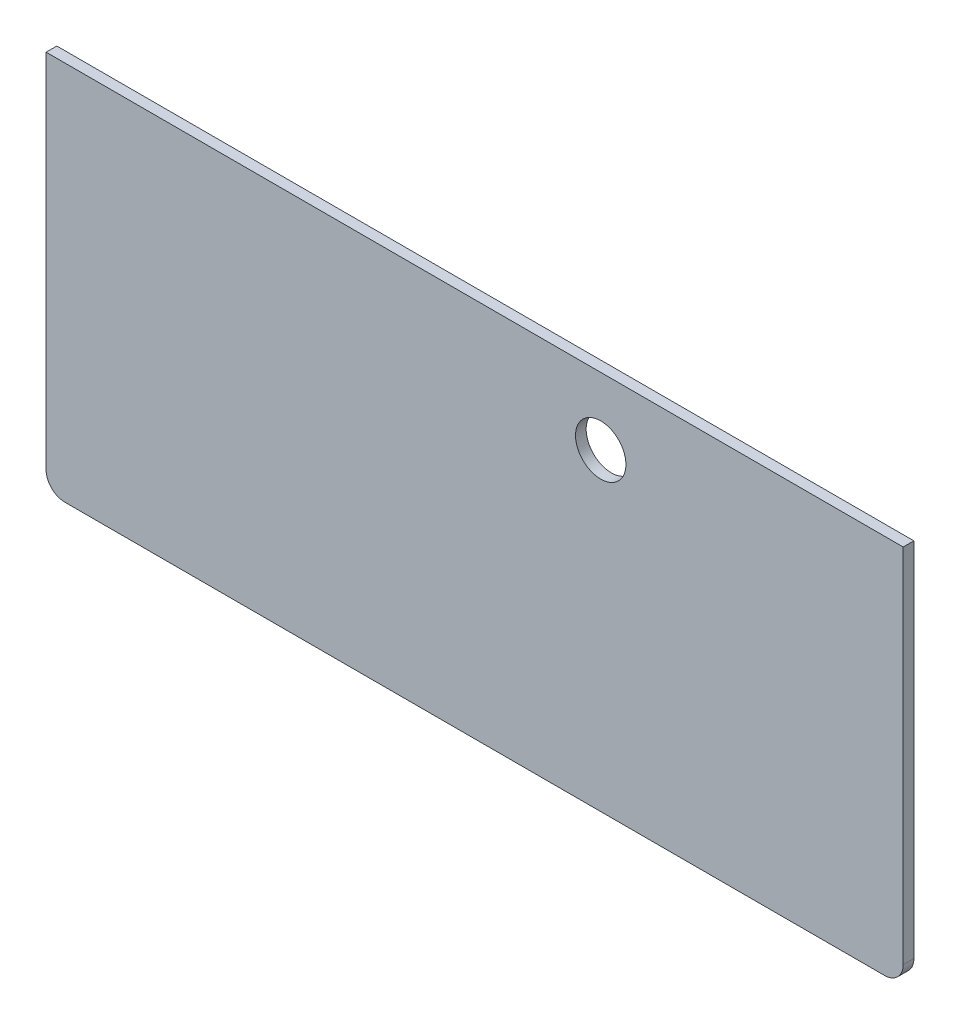
ISO-10303-21;
HEADER;
FILE_DESCRIPTION(('STEP AP214'),'2;1');
FILE_NAME('part.step','',(''),(''),'','','');
FILE_SCHEMA(('AUTOMOTIVE_DESIGN { 1 0 10303 214 1 1 1 1 }'));
ENDSEC;
DATA;
#1=APPLICATION_CONTEXT('core data for automotive mechanical design processes');
#2=APPLICATION_PROTOCOL_DEFINITION('international standard','automotive_design',2000,#1);
#3=PRODUCT_CONTEXT('',#1,'mechanical');
#4=PRODUCT('Part','Part','',(#3));
#5=PRODUCT_RELATED_PRODUCT_CATEGORY('part','',(#4));
#6=PRODUCT_DEFINITION_FORMATION('','',#4);
#7=PRODUCT_DEFINITION_CONTEXT('part definition',#1,'design');
#8=PRODUCT_DEFINITION('design','',#6,#7);
#9=PRODUCT_DEFINITION_SHAPE('','',#8);
#10=(LENGTH_UNIT() NAMED_UNIT(*) SI_UNIT(.MILLI.,.METRE.));
#11=(NAMED_UNIT(*) PLANE_ANGLE_UNIT() SI_UNIT($,.RADIAN.));
#12=(NAMED_UNIT(*) SI_UNIT($,.STERADIAN.) SOLID_ANGLE_UNIT());
#13=UNCERTAINTY_MEASURE_WITH_UNIT(LENGTH_MEASURE(1.E-05),#10,'distance_accuracy_value','');
#14=(GEOMETRIC_REPRESENTATION_CONTEXT(3) GLOBAL_UNCERTAINTY_ASSIGNED_CONTEXT((#13)) GLOBAL_UNIT_ASSIGNED_CONTEXT((#10,
#11,#12)) REPRESENTATION_CONTEXT('',''));
#15=CARTESIAN_POINT('',(0.,0.,0.));
#16=DIRECTION('',(0.,0.,1.));
#17=DIRECTION('',(1.,0.,0.));
#18=AXIS2_PLACEMENT_3D('',#15,#16,#17);
#19=CARTESIAN_POINT('',(0.,0.,3.175));
#20=DIRECTION('',(0.,0.,1.));
#21=DIRECTION('',(1.,0.,0.));
#22=AXIS2_PLACEMENT_3D('',#19,#20,#21);
#23=PLANE('',#22);
#24=DIRECTION('',(0.,-1.,0.));
#25=VECTOR('',#24,1.);
#26=CARTESIAN_POINT('',(-151.765375854214,27.1867881548974,3.175));
#27=LINE('',#26,#25);
#28=CARTESIAN_POINT('',(-151.765375854214,27.1867881548974,3.175));
#29=VERTEX_POINT('',#28);
#30=CARTESIAN_POINT('',(-151.765375854214,-80.4319618451025,3.175));
#31=VERTEX_POINT('',#30);
#32=EDGE_CURVE('E86',#29,#31,#27,.T.);
#33=ORIENTED_EDGE('',*,*,#32,.T.);
#34=CARTESIAN_POINT('',(-146.209125854214,-80.4319618451025,3.175));
#35=DIRECTION('',(0.,0.,1.));
#36=DIRECTION('',(1.,0.,0.));
#37=AXIS2_PLACEMENT_3D('',#34,#35,#36);
#38=CIRCLE('',#37,5.55625);
#39=CARTESIAN_POINT('',(-146.209125854214,-85.9882118451025,3.175));
#40=VERTEX_POINT('',#39);
#41=EDGE_CURVE('E41',#31,#40,#38,.T.);
#42=ORIENTED_EDGE('',*,*,#41,.T.);
#43=DIRECTION('',(1.,0.,0.));
#44=VECTOR('',#43,1.);
#45=CARTESIAN_POINT('',(-151.765375854214,-85.9882118451025,3.175));
#46=LINE('',#45,#44);
#47=CARTESIAN_POINT('',(97.6783741457858,-85.9882118451025,3.175));
#48=VERTEX_POINT('',#47);
#49=EDGE_CURVE('E93',#40,#48,#46,.T.);
#50=ORIENTED_EDGE('',*,*,#49,.T.);
#51=CARTESIAN_POINT('',(97.6783741457859,-80.4319618451025,3.175));
#52=DIRECTION('',(0.,0.,1.));
#53=DIRECTION('',(1.,0.,0.));
#54=AXIS2_PLACEMENT_3D('',#51,#52,#53);
#55=CIRCLE('',#54,5.55625);
#56=CARTESIAN_POINT('',(103.234624145786,-80.4319618451025,3.175));
#57=VERTEX_POINT('',#56);
#58=EDGE_CURVE('E48',#48,#57,#55,.T.);
#59=ORIENTED_EDGE('',*,*,#58,.T.);
#60=DIRECTION('',(0.,1.,0.));
#61=VECTOR('',#60,1.);
#62=CARTESIAN_POINT('',(103.234624145786,-85.9882118451025,3.175));
#63=LINE('',#62,#61);
#64=CARTESIAN_POINT('',(103.234624145786,27.1867881548975,3.175));
#65=VERTEX_POINT('',#64);
#66=EDGE_CURVE('E98',#57,#65,#63,.T.);
#67=ORIENTED_EDGE('',*,*,#66,.T.);
#68=DIRECTION('',(-1.,0.,0.));
#69=VECTOR('',#68,1.);
#70=CARTESIAN_POINT('',(103.234624145786,27.1867881548975,3.175));
#71=LINE('',#70,#69);
#72=EDGE_CURVE('E94',#65,#29,#71,.T.);
#73=ORIENTED_EDGE('',*,*,#72,.T.);
#74=EDGE_LOOP('',(#33,#42,#50,#59,#67,#73));
#75=FACE_BOUND('',#74,.T.);
#76=CARTESIAN_POINT('',(13.2346241457859,7.18678815489746,3.175));
#77=DIRECTION('',(0.,0.,1.));
#78=DIRECTION('',(1.,0.,0.));
#79=AXIS2_PLACEMENT_3D('',#76,#77,#78);
#80=CIRCLE('',#79,7.5);
#81=CARTESIAN_POINT('',(20.7346241457859,7.18678815489746,3.175));
#82=VERTEX_POINT('',#81);
#83=EDGE_CURVE('E139',#82,#82,#80,.T.);
#84=ORIENTED_EDGE('',*,*,#83,.F.);
#85=EDGE_LOOP('',(#84));
#86=FACE_BOUND('',#85,.T.);
#87=ADVANCED_FACE('F33',(#75,#86),#23,.T.);
#88=CARTESIAN_POINT('',(0.,0.,0.));
#89=DIRECTION('',(0.,0.,1.));
#90=DIRECTION('',(1.,0.,0.));
#91=AXIS2_PLACEMENT_3D('',#88,#89,#90);
#92=PLANE('',#91);
#93=DIRECTION('',(1.,0.,0.));
#94=VECTOR('',#93,1.);
#95=CARTESIAN_POINT('',(-151.765375854214,-85.9882118451025,0.));
#96=LINE('',#95,#94);
#97=CARTESIAN_POINT('',(-146.209125854214,-85.9882118451025,0.));
#98=VERTEX_POINT('',#97);
#99=CARTESIAN_POINT('',(97.6783741457858,-85.9882118451025,0.));
#100=VERTEX_POINT('',#99);
#101=EDGE_CURVE('E136',#98,#100,#96,.T.);
#102=ORIENTED_EDGE('',*,*,#101,.F.);
#103=CARTESIAN_POINT('',(-146.209125854214,-80.4319618451025,0.));
#104=DIRECTION('',(0.,0.,1.));
#105=DIRECTION('',(1.,0.,0.));
#106=AXIS2_PLACEMENT_3D('',#103,#104,#105);
#107=CIRCLE('',#106,5.55625);
#108=CARTESIAN_POINT('',(-151.765375854214,-80.4319618451025,0.));
#109=VERTEX_POINT('',#108);
#110=EDGE_CURVE('E119',#98,#109,#107,.F.);
#111=ORIENTED_EDGE('',*,*,#110,.T.);
#112=DIRECTION('',(0.,-1.,0.));
#113=VECTOR('',#112,1.);
#114=CARTESIAN_POINT('',(-151.765375854214,27.1867881548974,0.));
#115=LINE('',#114,#113);
#116=CARTESIAN_POINT('',(-151.765375854214,27.1867881548974,0.));
#117=VERTEX_POINT('',#116);
#118=EDGE_CURVE('E135',#117,#109,#115,.T.);
#119=ORIENTED_EDGE('',*,*,#118,.F.);
#120=DIRECTION('',(-1.,0.,0.));
#121=VECTOR('',#120,1.);
#122=CARTESIAN_POINT('',(103.234624145786,27.1867881548975,0.));
#123=LINE('',#122,#121);
#124=CARTESIAN_POINT('',(103.234624145786,27.1867881548975,0.));
#125=VERTEX_POINT('',#124);
#126=EDGE_CURVE('E106',#125,#117,#123,.T.);
#127=ORIENTED_EDGE('',*,*,#126,.F.);
#128=DIRECTION('',(0.,1.,0.));
#129=VECTOR('',#128,1.);
#130=CARTESIAN_POINT('',(103.234624145786,-85.9882118451025,0.));
#131=LINE('',#130,#129);
#132=CARTESIAN_POINT('',(103.234624145786,-80.4319618451025,0.));
#133=VERTEX_POINT('',#132);
#134=EDGE_CURVE('E102',#133,#125,#131,.T.);
#135=ORIENTED_EDGE('',*,*,#134,.F.);
#136=CARTESIAN_POINT('',(97.6783741457859,-80.4319618451025,0.));
#137=DIRECTION('',(0.,0.,1.));
#138=DIRECTION('',(1.,0.,0.));
#139=AXIS2_PLACEMENT_3D('',#136,#137,#138);
#140=CIRCLE('',#139,5.55625);
#141=EDGE_CURVE('E117',#133,#100,#140,.F.);
#142=ORIENTED_EDGE('',*,*,#141,.T.);
#143=EDGE_LOOP('',(#102,#111,#119,#127,#135,#142));
#144=FACE_BOUND('',#143,.T.);
#145=CARTESIAN_POINT('',(13.2346241457859,7.18678815489746,0.));
#146=DIRECTION('',(0.,0.,1.));
#147=DIRECTION('',(1.,0.,0.));
#148=AXIS2_PLACEMENT_3D('',#145,#146,#147);
#149=CIRCLE('',#148,7.5);
#150=CARTESIAN_POINT('',(20.7346241457859,7.18678815489746,0.));
#151=VERTEX_POINT('',#150);
#152=EDGE_CURVE('E224',#151,#151,#149,.T.);
#153=ORIENTED_EDGE('',*,*,#152,.T.);
#154=EDGE_LOOP('',(#153));
#155=FACE_BOUND('',#154,.T.);
#156=ADVANCED_FACE('F133',(#144,#155),#92,.F.);
#157=CARTESIAN_POINT('',(103.234624145786,27.1867881548975,3.175));
#158=DIRECTION('',(0.,-1.,0.));
#159=DIRECTION('',(1.,0.,0.));
#160=AXIS2_PLACEMENT_3D('',#157,#158,#159);
#161=PLANE('',#160);
#162=ORIENTED_EDGE('',*,*,#126,.T.);
#163=DIRECTION('',(0.,0.,-1.));
#164=VECTOR('',#163,1.);
#165=CARTESIAN_POINT('',(-151.765375854214,27.1867881548974,3.175));
#166=LINE('',#165,#164);
#167=EDGE_CURVE('E90',#29,#117,#166,.T.);
#168=ORIENTED_EDGE('',*,*,#167,.F.);
#169=ORIENTED_EDGE('',*,*,#72,.F.);
#170=DIRECTION('',(0.,0.,-1.));
#171=VECTOR('',#170,1.);
#172=CARTESIAN_POINT('',(103.234624145786,27.1867881548975,3.175));
#173=LINE('',#172,#171);
#174=EDGE_CURVE('E108',#65,#125,#173,.T.);
#175=ORIENTED_EDGE('',*,*,#174,.T.);
#176=EDGE_LOOP('',(#162,#168,#169,#175));
#177=FACE_BOUND('',#176,.T.);
#178=ADVANCED_FACE('F104',(#177),#161,.F.);
#179=CARTESIAN_POINT('',(-151.765375854214,27.1867881548974,3.175));
#180=DIRECTION('',(1.,0.,0.));
#181=DIRECTION('',(0.,1.,0.));
#182=AXIS2_PLACEMENT_3D('',#179,#180,#181);
#183=PLANE('',#182);
#184=ORIENTED_EDGE('',*,*,#118,.T.);
#185=DIRECTION('',(0.,0.,-1.));
#186=VECTOR('',#185,1.);
#187=CARTESIAN_POINT('',(-151.765375854214,-80.4319618451025,3.175));
#188=LINE('',#187,#186);
#189=EDGE_CURVE('E56',#109,#31,#188,.F.);
#190=ORIENTED_EDGE('',*,*,#189,.T.);
#191=ORIENTED_EDGE('',*,*,#32,.F.);
#192=ORIENTED_EDGE('',*,*,#167,.T.);
#193=EDGE_LOOP('',(#184,#190,#191,#192));
#194=FACE_BOUND('',#193,.T.);
#195=ADVANCED_FACE('F88',(#194),#183,.F.);
#196=CARTESIAN_POINT('',(-151.765375854214,-85.9882118451025,3.175));
#197=DIRECTION('',(0.,1.,0.));
#198=DIRECTION('',(0.,0.,1.));
#199=AXIS2_PLACEMENT_3D('',#196,#197,#198);
#200=PLANE('',#199);
#201=ORIENTED_EDGE('',*,*,#49,.F.);
#202=DIRECTION('',(0.,0.,-1.));
#203=VECTOR('',#202,1.);
#204=CARTESIAN_POINT('',(-146.209125854214,-85.9882118451025,3.175));
#205=LINE('',#204,#203);
#206=EDGE_CURVE('E110',#40,#98,#205,.T.);
#207=ORIENTED_EDGE('',*,*,#206,.T.);
#208=ORIENTED_EDGE('',*,*,#101,.T.);
#209=DIRECTION('',(0.,0.,-1.));
#210=VECTOR('',#209,1.);
#211=CARTESIAN_POINT('',(97.6783741457858,-85.9882118451025,3.175));
#212=LINE('',#211,#210);
#213=EDGE_CURVE('E107',#100,#48,#212,.F.);
#214=ORIENTED_EDGE('',*,*,#213,.T.);
#215=EDGE_LOOP('',(#201,#207,#208,#214));
#216=FACE_BOUND('',#215,.T.);
#217=ADVANCED_FACE('F126',(#216),#200,.F.);
#218=CARTESIAN_POINT('',(103.234624145786,-85.9882118451025,3.175));
#219=DIRECTION('',(-1.,0.,0.));
#220=DIRECTION('',(0.,0.,1.));
#221=AXIS2_PLACEMENT_3D('',#218,#219,#220);
#222=PLANE('',#221);
#223=ORIENTED_EDGE('',*,*,#66,.F.);
#224=DIRECTION('',(0.,0.,-1.));
#225=VECTOR('',#224,1.);
#226=CARTESIAN_POINT('',(103.234624145786,-80.4319618451025,3.175));
#227=LINE('',#226,#225);
#228=EDGE_CURVE('E11',#57,#133,#227,.T.);
#229=ORIENTED_EDGE('',*,*,#228,.T.);
#230=ORIENTED_EDGE('',*,*,#134,.T.);
#231=ORIENTED_EDGE('',*,*,#174,.F.);
#232=EDGE_LOOP('',(#223,#229,#230,#231));
#233=FACE_BOUND('',#232,.T.);
#234=ADVANCED_FACE('F144',(#233),#222,.F.);
#235=CARTESIAN_POINT('',(13.2346241457859,7.18678815489746,3.175));
#236=DIRECTION('',(0.,0.,-1.));
#237=DIRECTION('',(-1.,0.,0.));
#238=AXIS2_PLACEMENT_3D('',#235,#236,#237);
#239=CYLINDRICAL_SURFACE('',#238,7.5);
#240=ORIENTED_EDGE('',*,*,#83,.T.);
#241=EDGE_LOOP('',(#240));
#242=FACE_BOUND('',#241,.T.);
#243=ORIENTED_EDGE('',*,*,#152,.F.);
#244=EDGE_LOOP('',(#243));
#245=FACE_BOUND('',#244,.T.);
#246=ADVANCED_FACE('F151',(#242,#245),#239,.F.);
#247=CARTESIAN_POINT('',(-146.209125854214,-80.4319618451025,3.175));
#248=DIRECTION('',(0.,0.,-1.));
#249=DIRECTION('',(-1.,0.,0.));
#250=AXIS2_PLACEMENT_3D('',#247,#248,#249);
#251=CYLINDRICAL_SURFACE('',#250,5.55625);
#252=ORIENTED_EDGE('',*,*,#41,.F.);
#253=ORIENTED_EDGE('',*,*,#189,.F.);
#254=ORIENTED_EDGE('',*,*,#110,.F.);
#255=ORIENTED_EDGE('',*,*,#206,.F.);
#256=EDGE_LOOP('',(#252,#253,#254,#255));
#257=FACE_BOUND('',#256,.T.);
#258=ADVANCED_FACE('F131',(#257),#251,.T.);
#259=CARTESIAN_POINT('',(97.6783741457859,-80.4319618451025,3.175));
#260=DIRECTION('',(0.,0.,-1.));
#261=DIRECTION('',(-1.,0.,0.));
#262=AXIS2_PLACEMENT_3D('',#259,#260,#261);
#263=CYLINDRICAL_SURFACE('',#262,5.55625);
#264=ORIENTED_EDGE('',*,*,#58,.F.);
#265=ORIENTED_EDGE('',*,*,#213,.F.);
#266=ORIENTED_EDGE('',*,*,#141,.F.);
#267=ORIENTED_EDGE('',*,*,#228,.F.);
#268=EDGE_LOOP('',(#264,#265,#266,#267));
#269=FACE_BOUND('',#268,.T.);
#270=ADVANCED_FACE('F35',(#269),#263,.T.);
#271=CLOSED_SHELL('',(#87,#156,#178,#195,#217,#234,#246,#258,#270));
#272=MANIFOLD_SOLID_BREP('B2',#271);
#273=ADVANCED_BREP_SHAPE_REPRESENTATION('',(#18,#272),#14);
#274=SHAPE_DEFINITION_REPRESENTATION(#9,#273);
ENDSEC;
END-ISO-10303-21;
